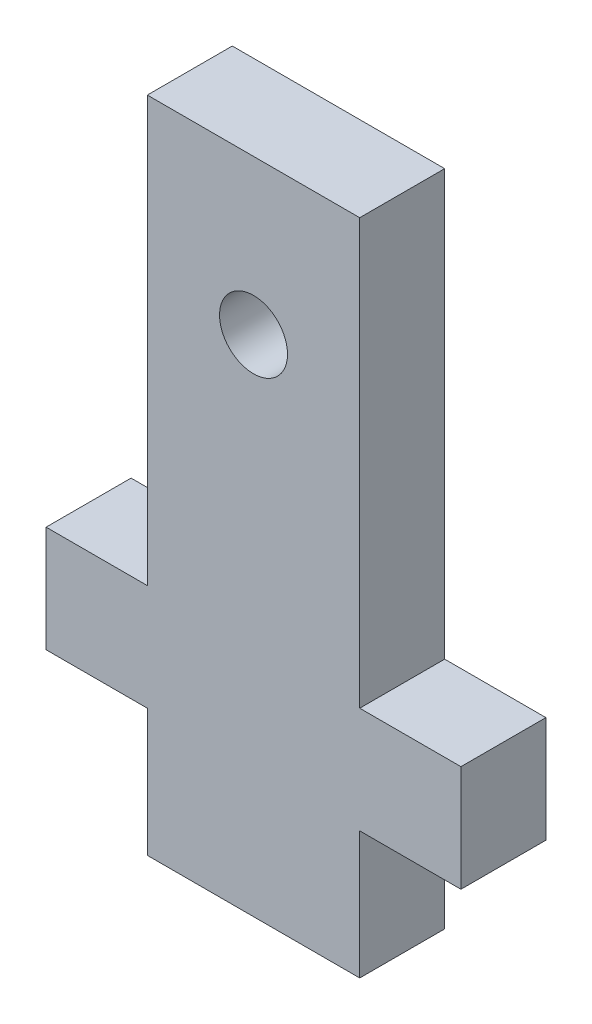
ISO-10303-21;
HEADER;
FILE_DESCRIPTION(('STEP AP214'),'2;1');
FILE_NAME('part.step','',(''),(''),'','','');
FILE_SCHEMA(('AUTOMOTIVE_DESIGN { 1 0 10303 214 1 1 1 1 }'));
ENDSEC;
DATA;
#1=APPLICATION_CONTEXT('core data for automotive mechanical design processes');
#2=APPLICATION_PROTOCOL_DEFINITION('international standard','automotive_design',2000,#1);
#3=PRODUCT_CONTEXT('',#1,'mechanical');
#4=PRODUCT('Part','Part','',(#3));
#5=PRODUCT_RELATED_PRODUCT_CATEGORY('part','',(#4));
#6=PRODUCT_DEFINITION_FORMATION('','',#4);
#7=PRODUCT_DEFINITION_CONTEXT('part definition',#1,'design');
#8=PRODUCT_DEFINITION('design','',#6,#7);
#9=PRODUCT_DEFINITION_SHAPE('','',#8);
#10=(LENGTH_UNIT() NAMED_UNIT(*) SI_UNIT(.MILLI.,.METRE.));
#11=(NAMED_UNIT(*) PLANE_ANGLE_UNIT() SI_UNIT($,.RADIAN.));
#12=(NAMED_UNIT(*) SI_UNIT($,.STERADIAN.) SOLID_ANGLE_UNIT());
#13=UNCERTAINTY_MEASURE_WITH_UNIT(LENGTH_MEASURE(1.E-05),#10,'distance_accuracy_value','');
#14=(GEOMETRIC_REPRESENTATION_CONTEXT(3) GLOBAL_UNCERTAINTY_ASSIGNED_CONTEXT((#13)) GLOBAL_UNIT_ASSIGNED_CONTEXT((#10,
#11,#12)) REPRESENTATION_CONTEXT('',''));
#15=CARTESIAN_POINT('',(0.,0.,0.));
#16=DIRECTION('',(0.,0.,1.));
#17=DIRECTION('',(1.,0.,0.));
#18=AXIS2_PLACEMENT_3D('',#15,#16,#17);
#19=CARTESIAN_POINT('',(0.,7.62,5.08));
#20=DIRECTION('',(1.,0.,0.));
#21=DIRECTION('',(0.,1.,0.));
#22=AXIS2_PLACEMENT_3D('',#19,#20,#21);
#23=PLANE('',#22);
#24=DIRECTION('',(0.,-1.,0.));
#25=VECTOR('',#24,1.);
#26=CARTESIAN_POINT('',(0.,7.62,0.));
#27=LINE('',#26,#25);
#28=CARTESIAN_POINT('',(0.,7.62,0.));
#29=VERTEX_POINT('',#28);
#30=CARTESIAN_POINT('',(0.,0.,0.));
#31=VERTEX_POINT('',#30);
#32=EDGE_CURVE('E154',#29,#31,#27,.T.);
#33=ORIENTED_EDGE('',*,*,#32,.T.);
#34=DIRECTION('',(0.,0.,-1.));
#35=VECTOR('',#34,1.);
#36=CARTESIAN_POINT('',(0.,0.,5.08));
#37=LINE('',#36,#35);
#38=CARTESIAN_POINT('',(0.,0.,5.08));
#39=VERTEX_POINT('',#38);
#40=EDGE_CURVE('E11',#39,#31,#37,.T.);
#41=ORIENTED_EDGE('',*,*,#40,.F.);
#42=DIRECTION('',(0.,-1.,0.));
#43=VECTOR('',#42,1.);
#44=CARTESIAN_POINT('',(0.,7.62,5.08));
#45=LINE('',#44,#43);
#46=CARTESIAN_POINT('',(0.,7.62,5.08));
#47=VERTEX_POINT('',#46);
#48=EDGE_CURVE('E176',#47,#39,#45,.T.);
#49=ORIENTED_EDGE('',*,*,#48,.F.);
#50=DIRECTION('',(0.,0.,-1.));
#51=VECTOR('',#50,1.);
#52=CARTESIAN_POINT('',(0.,7.62,5.08));
#53=LINE('',#52,#51);
#54=EDGE_CURVE('E150',#47,#29,#53,.T.);
#55=ORIENTED_EDGE('',*,*,#54,.T.);
#56=EDGE_LOOP('',(#33,#41,#49,#55));
#57=FACE_BOUND('',#56,.T.);
#58=ADVANCED_FACE('F33',(#57),#23,.F.);
#59=CARTESIAN_POINT('',(0.,0.,5.08));
#60=DIRECTION('',(0.,1.,0.));
#61=DIRECTION('',(0.,0.,1.));
#62=AXIS2_PLACEMENT_3D('',#59,#60,#61);
#63=PLANE('',#62);
#64=DIRECTION('',(1.,0.,0.));
#65=VECTOR('',#64,1.);
#66=CARTESIAN_POINT('',(0.,0.,0.));
#67=LINE('',#66,#65);
#68=CARTESIAN_POINT('',(12.7,0.,0.));
#69=VERTEX_POINT('',#68);
#70=EDGE_CURVE('E157',#31,#69,#67,.T.);
#71=ORIENTED_EDGE('',*,*,#70,.T.);
#72=DIRECTION('',(0.,0.,-1.));
#73=VECTOR('',#72,1.);
#74=CARTESIAN_POINT('',(12.7,0.,5.08));
#75=LINE('',#74,#73);
#76=CARTESIAN_POINT('',(12.7,0.,5.08));
#77=VERTEX_POINT('',#76);
#78=EDGE_CURVE('E42',#77,#69,#75,.T.);
#79=ORIENTED_EDGE('',*,*,#78,.F.);
#80=DIRECTION('',(1.,0.,0.));
#81=VECTOR('',#80,1.);
#82=CARTESIAN_POINT('',(0.,0.,5.08));
#83=LINE('',#82,#81);
#84=EDGE_CURVE('E105',#39,#77,#83,.T.);
#85=ORIENTED_EDGE('',*,*,#84,.F.);
#86=ORIENTED_EDGE('',*,*,#40,.T.);
#87=EDGE_LOOP('',(#71,#79,#85,#86));
#88=FACE_BOUND('',#87,.T.);
#89=ADVANCED_FACE('F256',(#88),#63,.F.);
#90=CARTESIAN_POINT('',(12.7,0.,5.08));
#91=DIRECTION('',(-1.,0.,0.));
#92=DIRECTION('',(0.,0.,1.));
#93=AXIS2_PLACEMENT_3D('',#90,#91,#92);
#94=PLANE('',#93);
#95=DIRECTION('',(0.,1.,0.));
#96=VECTOR('',#95,1.);
#97=CARTESIAN_POINT('',(12.7,0.,0.));
#98=LINE('',#97,#96);
#99=CARTESIAN_POINT('',(12.7,7.62,0.));
#100=VERTEX_POINT('',#99);
#101=EDGE_CURVE('E159',#69,#100,#98,.T.);
#102=ORIENTED_EDGE('',*,*,#101,.T.);
#103=DIRECTION('',(0.,0.,-1.));
#104=VECTOR('',#103,1.);
#105=CARTESIAN_POINT('',(12.7,7.62,5.08));
#106=LINE('',#105,#104);
#107=CARTESIAN_POINT('',(12.7,7.62,5.08));
#108=VERTEX_POINT('',#107);
#109=EDGE_CURVE('E195',#108,#100,#106,.T.);
#110=ORIENTED_EDGE('',*,*,#109,.F.);
#111=DIRECTION('',(0.,1.,0.));
#112=VECTOR('',#111,1.);
#113=CARTESIAN_POINT('',(12.7,0.,5.08));
#114=LINE('',#113,#112);
#115=EDGE_CURVE('E204',#77,#108,#114,.T.);
#116=ORIENTED_EDGE('',*,*,#115,.F.);
#117=ORIENTED_EDGE('',*,*,#78,.T.);
#118=EDGE_LOOP('',(#102,#110,#116,#117));
#119=FACE_BOUND('',#118,.T.);
#120=ADVANCED_FACE('F202',(#119),#94,.F.);
#121=CARTESIAN_POINT('',(12.7,7.62,5.08));
#122=DIRECTION('',(0.,1.,0.));
#123=DIRECTION('',(0.,0.,1.));
#124=AXIS2_PLACEMENT_3D('',#121,#122,#123);
#125=PLANE('',#124);
#126=DIRECTION('',(1.,0.,0.));
#127=VECTOR('',#126,1.);
#128=CARTESIAN_POINT('',(12.7,7.62,0.));
#129=LINE('',#128,#127);
#130=CARTESIAN_POINT('',(18.7514106583072,7.62,0.));
#131=VERTEX_POINT('',#130);
#132=EDGE_CURVE('E161',#100,#131,#129,.T.);
#133=ORIENTED_EDGE('',*,*,#132,.T.);
#134=DIRECTION('',(0.,0.,-1.));
#135=VECTOR('',#134,1.);
#136=CARTESIAN_POINT('',(18.7514106583072,7.62,5.08));
#137=LINE('',#136,#135);
#138=CARTESIAN_POINT('',(18.7514106583072,7.62,5.08));
#139=VERTEX_POINT('',#138);
#140=EDGE_CURVE('E192',#139,#131,#137,.T.);
#141=ORIENTED_EDGE('',*,*,#140,.F.);
#142=DIRECTION('',(1.,0.,0.));
#143=VECTOR('',#142,1.);
#144=CARTESIAN_POINT('',(12.7,7.62,5.08));
#145=LINE('',#144,#143);
#146=EDGE_CURVE('E222',#108,#139,#145,.T.);
#147=ORIENTED_EDGE('',*,*,#146,.F.);
#148=ORIENTED_EDGE('',*,*,#109,.T.);
#149=EDGE_LOOP('',(#133,#141,#147,#148));
#150=FACE_BOUND('',#149,.T.);
#151=ADVANCED_FACE('F213',(#150),#125,.F.);
#152=CARTESIAN_POINT('',(18.7514106583072,7.62,5.08));
#153=DIRECTION('',(-1.,0.,0.));
#154=DIRECTION('',(0.,0.,1.));
#155=AXIS2_PLACEMENT_3D('',#152,#153,#154);
#156=PLANE('',#155);
#157=DIRECTION('',(0.,1.,0.));
#158=VECTOR('',#157,1.);
#159=CARTESIAN_POINT('',(18.7514106583072,7.62,0.));
#160=LINE('',#159,#158);
#161=CARTESIAN_POINT('',(18.7514106583072,13.97,0.));
#162=VERTEX_POINT('',#161);
#163=EDGE_CURVE('E163',#131,#162,#160,.T.);
#164=ORIENTED_EDGE('',*,*,#163,.T.);
#165=DIRECTION('',(0.,0.,-1.));
#166=VECTOR('',#165,1.);
#167=CARTESIAN_POINT('',(18.7514106583072,13.97,5.08));
#168=LINE('',#167,#166);
#169=CARTESIAN_POINT('',(18.7514106583072,13.97,5.08));
#170=VERTEX_POINT('',#169);
#171=EDGE_CURVE('E189',#170,#162,#168,.T.);
#172=ORIENTED_EDGE('',*,*,#171,.F.);
#173=DIRECTION('',(0.,1.,0.));
#174=VECTOR('',#173,1.);
#175=CARTESIAN_POINT('',(18.7514106583072,7.62,5.08));
#176=LINE('',#175,#174);
#177=EDGE_CURVE('E219',#139,#170,#176,.T.);
#178=ORIENTED_EDGE('',*,*,#177,.F.);
#179=ORIENTED_EDGE('',*,*,#140,.T.);
#180=EDGE_LOOP('',(#164,#172,#178,#179));
#181=FACE_BOUND('',#180,.T.);
#182=ADVANCED_FACE('F217',(#181),#156,.F.);
#183=CARTESIAN_POINT('',(18.7514106583072,13.97,5.08));
#184=DIRECTION('',(0.,-1.,0.));
#185=DIRECTION('',(0.,0.,-1.));
#186=AXIS2_PLACEMENT_3D('',#183,#184,#185);
#187=PLANE('',#186);
#188=DIRECTION('',(-1.,0.,0.));
#189=VECTOR('',#188,1.);
#190=CARTESIAN_POINT('',(18.7514106583072,13.97,0.));
#191=LINE('',#190,#189);
#192=CARTESIAN_POINT('',(12.7,13.97,0.));
#193=VERTEX_POINT('',#192);
#194=EDGE_CURVE('E165',#162,#193,#191,.T.);
#195=ORIENTED_EDGE('',*,*,#194,.T.);
#196=DIRECTION('',(0.,0.,-1.));
#197=VECTOR('',#196,1.);
#198=CARTESIAN_POINT('',(12.7,13.97,5.08));
#199=LINE('',#198,#197);
#200=CARTESIAN_POINT('',(12.7,13.97,5.08));
#201=VERTEX_POINT('',#200);
#202=EDGE_CURVE('E186',#201,#193,#199,.T.);
#203=ORIENTED_EDGE('',*,*,#202,.F.);
#204=DIRECTION('',(-1.,0.,0.));
#205=VECTOR('',#204,1.);
#206=CARTESIAN_POINT('',(18.7514106583072,13.97,5.08));
#207=LINE('',#206,#205);
#208=EDGE_CURVE('E221',#170,#201,#207,.T.);
#209=ORIENTED_EDGE('',*,*,#208,.F.);
#210=ORIENTED_EDGE('',*,*,#171,.T.);
#211=EDGE_LOOP('',(#195,#203,#209,#210));
#212=FACE_BOUND('',#211,.T.);
#213=ADVANCED_FACE('F269',(#212),#187,.F.);
#214=CARTESIAN_POINT('',(12.7,13.97,5.08));
#215=DIRECTION('',(-1.,0.,0.));
#216=DIRECTION('',(0.,0.,1.));
#217=AXIS2_PLACEMENT_3D('',#214,#215,#216);
#218=PLANE('',#217);
#219=DIRECTION('',(0.,1.,0.));
#220=VECTOR('',#219,1.);
#221=CARTESIAN_POINT('',(12.7,13.97,0.));
#222=LINE('',#221,#220);
#223=CARTESIAN_POINT('',(12.7,39.37,0.));
#224=VERTEX_POINT('',#223);
#225=EDGE_CURVE('E167',#193,#224,#222,.T.);
#226=ORIENTED_EDGE('',*,*,#225,.T.);
#227=DIRECTION('',(0.,0.,-1.));
#228=VECTOR('',#227,1.);
#229=CARTESIAN_POINT('',(12.7,39.37,5.08));
#230=LINE('',#229,#228);
#231=CARTESIAN_POINT('',(12.7,39.37,5.08));
#232=VERTEX_POINT('',#231);
#233=EDGE_CURVE('E183',#232,#224,#230,.T.);
#234=ORIENTED_EDGE('',*,*,#233,.F.);
#235=DIRECTION('',(0.,1.,0.));
#236=VECTOR('',#235,1.);
#237=CARTESIAN_POINT('',(12.7,13.97,5.08));
#238=LINE('',#237,#236);
#239=EDGE_CURVE('E224',#201,#232,#238,.T.);
#240=ORIENTED_EDGE('',*,*,#239,.F.);
#241=ORIENTED_EDGE('',*,*,#202,.T.);
#242=EDGE_LOOP('',(#226,#234,#240,#241));
#243=FACE_BOUND('',#242,.T.);
#244=ADVANCED_FACE('F272',(#243),#218,.F.);
#245=CARTESIAN_POINT('',(12.7,39.37,5.08));
#246=DIRECTION('',(0.,-1.,0.));
#247=DIRECTION('',(1.,0.,0.));
#248=AXIS2_PLACEMENT_3D('',#245,#246,#247);
#249=PLANE('',#248);
#250=DIRECTION('',(-1.,0.,0.));
#251=VECTOR('',#250,1.);
#252=CARTESIAN_POINT('',(12.7,39.37,0.));
#253=LINE('',#252,#251);
#254=CARTESIAN_POINT('',(0.,39.37,0.));
#255=VERTEX_POINT('',#254);
#256=EDGE_CURVE('E169',#224,#255,#253,.T.);
#257=ORIENTED_EDGE('',*,*,#256,.T.);
#258=DIRECTION('',(0.,0.,-1.));
#259=VECTOR('',#258,1.);
#260=CARTESIAN_POINT('',(0.,39.37,5.08));
#261=LINE('',#260,#259);
#262=CARTESIAN_POINT('',(0.,39.37,5.08));
#263=VERTEX_POINT('',#262);
#264=EDGE_CURVE('E180',#263,#255,#261,.T.);
#265=ORIENTED_EDGE('',*,*,#264,.F.);
#266=DIRECTION('',(-1.,0.,0.));
#267=VECTOR('',#266,1.);
#268=CARTESIAN_POINT('',(12.7,39.37,5.08));
#269=LINE('',#268,#267);
#270=EDGE_CURVE('E230',#232,#263,#269,.T.);
#271=ORIENTED_EDGE('',*,*,#270,.F.);
#272=ORIENTED_EDGE('',*,*,#233,.T.);
#273=EDGE_LOOP('',(#257,#265,#271,#272));
#274=FACE_BOUND('',#273,.T.);
#275=ADVANCED_FACE('F236',(#274),#249,.F.);
#276=CARTESIAN_POINT('',(0.,39.37,5.08));
#277=DIRECTION('',(1.,0.,0.));
#278=DIRECTION('',(0.,1.,0.));
#279=AXIS2_PLACEMENT_3D('',#276,#277,#278);
#280=PLANE('',#279);
#281=DIRECTION('',(0.,-1.,0.));
#282=VECTOR('',#281,1.);
#283=CARTESIAN_POINT('',(0.,39.37,0.));
#284=LINE('',#283,#282);
#285=CARTESIAN_POINT('',(0.,13.97,0.));
#286=VERTEX_POINT('',#285);
#287=EDGE_CURVE('E171',#255,#286,#284,.T.);
#288=ORIENTED_EDGE('',*,*,#287,.T.);
#289=DIRECTION('',(0.,0.,-1.));
#290=VECTOR('',#289,1.);
#291=CARTESIAN_POINT('',(0.,13.97,5.08));
#292=LINE('',#291,#290);
#293=CARTESIAN_POINT('',(0.,13.97,5.08));
#294=VERTEX_POINT('',#293);
#295=EDGE_CURVE('E145',#294,#286,#292,.T.);
#296=ORIENTED_EDGE('',*,*,#295,.F.);
#297=DIRECTION('',(0.,-1.,0.));
#298=VECTOR('',#297,1.);
#299=CARTESIAN_POINT('',(0.,39.37,5.08));
#300=LINE('',#299,#298);
#301=EDGE_CURVE('E136',#263,#294,#300,.T.);
#302=ORIENTED_EDGE('',*,*,#301,.F.);
#303=ORIENTED_EDGE('',*,*,#264,.T.);
#304=EDGE_LOOP('',(#288,#296,#302,#303));
#305=FACE_BOUND('',#304,.T.);
#306=ADVANCED_FACE('F240',(#305),#280,.F.);
#307=CARTESIAN_POINT('',(0.,13.97,5.08));
#308=DIRECTION('',(0.,-1.,0.));
#309=DIRECTION('',(0.,0.,-1.));
#310=AXIS2_PLACEMENT_3D('',#307,#308,#309);
#311=PLANE('',#310);
#312=DIRECTION('',(-1.,0.,0.));
#313=VECTOR('',#312,1.);
#314=CARTESIAN_POINT('',(0.,13.97,0.));
#315=LINE('',#314,#313);
#316=CARTESIAN_POINT('',(-6.05141065830722,13.97,0.));
#317=VERTEX_POINT('',#316);
#318=EDGE_CURVE('E144',#286,#317,#315,.T.);
#319=ORIENTED_EDGE('',*,*,#318,.T.);
#320=DIRECTION('',(0.,0.,-1.));
#321=VECTOR('',#320,1.);
#322=CARTESIAN_POINT('',(-6.05141065830722,13.97,5.08));
#323=LINE('',#322,#321);
#324=CARTESIAN_POINT('',(-6.05141065830722,13.97,5.08));
#325=VERTEX_POINT('',#324);
#326=EDGE_CURVE('E141',#325,#317,#323,.T.);
#327=ORIENTED_EDGE('',*,*,#326,.F.);
#328=DIRECTION('',(-1.,0.,0.));
#329=VECTOR('',#328,1.);
#330=CARTESIAN_POINT('',(0.,13.97,5.08));
#331=LINE('',#330,#329);
#332=EDGE_CURVE('E130',#294,#325,#331,.T.);
#333=ORIENTED_EDGE('',*,*,#332,.F.);
#334=ORIENTED_EDGE('',*,*,#295,.T.);
#335=EDGE_LOOP('',(#319,#327,#333,#334));
#336=FACE_BOUND('',#335,.T.);
#337=ADVANCED_FACE('F142',(#336),#311,.F.);
#338=CARTESIAN_POINT('',(-6.05141065830722,13.97,5.08));
#339=DIRECTION('',(1.,0.,0.));
#340=DIRECTION('',(0.,1.,0.));
#341=AXIS2_PLACEMENT_3D('',#338,#339,#340);
#342=PLANE('',#341);
#343=DIRECTION('',(0.,-1.,0.));
#344=VECTOR('',#343,1.);
#345=CARTESIAN_POINT('',(-6.05141065830722,13.97,0.));
#346=LINE('',#345,#344);
#347=CARTESIAN_POINT('',(-6.05141065830722,7.62,0.));
#348=VERTEX_POINT('',#347);
#349=EDGE_CURVE('E91',#317,#348,#346,.T.);
#350=ORIENTED_EDGE('',*,*,#349,.T.);
#351=DIRECTION('',(0.,0.,-1.));
#352=VECTOR('',#351,1.);
#353=CARTESIAN_POINT('',(-6.05141065830722,7.62,5.08));
#354=LINE('',#353,#352);
#355=CARTESIAN_POINT('',(-6.05141065830722,7.62,5.08));
#356=VERTEX_POINT('',#355);
#357=EDGE_CURVE('E146',#356,#348,#354,.T.);
#358=ORIENTED_EDGE('',*,*,#357,.F.);
#359=DIRECTION('',(0.,-1.,0.));
#360=VECTOR('',#359,1.);
#361=CARTESIAN_POINT('',(-6.05141065830722,13.97,5.08));
#362=LINE('',#361,#360);
#363=EDGE_CURVE('E134',#325,#356,#362,.T.);
#364=ORIENTED_EDGE('',*,*,#363,.F.);
#365=ORIENTED_EDGE('',*,*,#326,.T.);
#366=EDGE_LOOP('',(#350,#358,#364,#365));
#367=FACE_BOUND('',#366,.T.);
#368=ADVANCED_FACE('F148',(#367),#342,.F.);
#369=CARTESIAN_POINT('',(-6.05141065830722,7.62,5.08));
#370=DIRECTION('',(0.,1.,0.));
#371=DIRECTION('',(0.,0.,1.));
#372=AXIS2_PLACEMENT_3D('',#369,#370,#371);
#373=PLANE('',#372);
#374=DIRECTION('',(1.,0.,0.));
#375=VECTOR('',#374,1.);
#376=CARTESIAN_POINT('',(-6.05141065830722,7.62,0.));
#377=LINE('',#376,#375);
#378=EDGE_CURVE('E97',#348,#29,#377,.T.);
#379=ORIENTED_EDGE('',*,*,#378,.T.);
#380=ORIENTED_EDGE('',*,*,#54,.F.);
#381=DIRECTION('',(1.,0.,0.));
#382=VECTOR('',#381,1.);
#383=CARTESIAN_POINT('',(-6.05141065830722,7.62,5.08));
#384=LINE('',#383,#382);
#385=EDGE_CURVE('E50',#356,#47,#384,.T.);
#386=ORIENTED_EDGE('',*,*,#385,.F.);
#387=ORIENTED_EDGE('',*,*,#357,.T.);
#388=EDGE_LOOP('',(#379,#380,#386,#387));
#389=FACE_BOUND('',#388,.T.);
#390=ADVANCED_FACE('F244',(#389),#373,.F.);
#391=CARTESIAN_POINT('',(0.,0.,5.08));
#392=DIRECTION('',(0.,0.,1.));
#393=DIRECTION('',(1.,0.,0.));
#394=AXIS2_PLACEMENT_3D('',#391,#392,#393);
#395=PLANE('',#394);
#396=CARTESIAN_POINT('',(6.35,30.1408654251247,5.08));
#397=DIRECTION('',(0.,0.,1.));
#398=DIRECTION('',(1.,0.,0.));
#399=AXIS2_PLACEMENT_3D('',#396,#397,#398);
#400=CIRCLE('',#399,2.032);
#401=CARTESIAN_POINT('',(8.382,30.1408654251247,5.08));
#402=VERTEX_POINT('',#401);
#403=EDGE_CURVE('E325',#402,#402,#400,.T.);
#404=ORIENTED_EDGE('',*,*,#403,.F.);
#405=EDGE_LOOP('',(#404));
#406=FACE_BOUND('',#405,.T.);
#407=ORIENTED_EDGE('',*,*,#48,.T.);
#408=ORIENTED_EDGE('',*,*,#84,.T.);
#409=ORIENTED_EDGE('',*,*,#115,.T.);
#410=ORIENTED_EDGE('',*,*,#146,.T.);
#411=ORIENTED_EDGE('',*,*,#177,.T.);
#412=ORIENTED_EDGE('',*,*,#208,.T.);
#413=ORIENTED_EDGE('',*,*,#239,.T.);
#414=ORIENTED_EDGE('',*,*,#270,.T.);
#415=ORIENTED_EDGE('',*,*,#301,.T.);
#416=ORIENTED_EDGE('',*,*,#332,.T.);
#417=ORIENTED_EDGE('',*,*,#363,.T.);
#418=ORIENTED_EDGE('',*,*,#385,.T.);
#419=EDGE_LOOP('',(#407,#408,#409,#410,#411,#412,#413,#414,#415,#416,#417,#418));
#420=FACE_BOUND('',#419,.T.);
#421=ADVANCED_FACE('F132',(#406,#420),#395,.T.);
#422=CARTESIAN_POINT('',(0.,0.,0.));
#423=DIRECTION('',(0.,0.,1.));
#424=DIRECTION('',(1.,0.,0.));
#425=AXIS2_PLACEMENT_3D('',#422,#423,#424);
#426=PLANE('',#425);
#427=CARTESIAN_POINT('',(6.35,30.1408654251247,0.));
#428=DIRECTION('',(0.,0.,1.));
#429=DIRECTION('',(1.,0.,0.));
#430=AXIS2_PLACEMENT_3D('',#427,#428,#429);
#431=CIRCLE('',#430,2.032);
#432=CARTESIAN_POINT('',(8.382,30.1408654251247,0.));
#433=VERTEX_POINT('',#432);
#434=EDGE_CURVE('E36',#433,#433,#431,.T.);
#435=ORIENTED_EDGE('',*,*,#434,.T.);
#436=EDGE_LOOP('',(#435));
#437=FACE_BOUND('',#436,.T.);
#438=ORIENTED_EDGE('',*,*,#32,.F.);
#439=ORIENTED_EDGE('',*,*,#378,.F.);
#440=ORIENTED_EDGE('',*,*,#349,.F.);
#441=ORIENTED_EDGE('',*,*,#318,.F.);
#442=ORIENTED_EDGE('',*,*,#287,.F.);
#443=ORIENTED_EDGE('',*,*,#256,.F.);
#444=ORIENTED_EDGE('',*,*,#225,.F.);
#445=ORIENTED_EDGE('',*,*,#194,.F.);
#446=ORIENTED_EDGE('',*,*,#163,.F.);
#447=ORIENTED_EDGE('',*,*,#132,.F.);
#448=ORIENTED_EDGE('',*,*,#101,.F.);
#449=ORIENTED_EDGE('',*,*,#70,.F.);
#450=EDGE_LOOP('',(#438,#439,#440,#441,#442,#443,#444,#445,#446,#447,#448,#449));
#451=FACE_BOUND('',#450,.T.);
#452=ADVANCED_FACE('F208',(#437,#451),#426,.F.);
#453=CARTESIAN_POINT('',(6.35,30.1408654251247,-2.54));
#454=DIRECTION('',(0.,0.,1.));
#455=DIRECTION('',(1.,0.,0.));
#456=AXIS2_PLACEMENT_3D('',#453,#454,#455);
#457=CYLINDRICAL_SURFACE('',#456,2.032);
#458=CARTESIAN_POINT('',(8.382,30.1408654251247,5.08));
#459=CARTESIAN_POINT('',(8.382,30.1408654251247,5.02708333333333));
#460=CARTESIAN_POINT('',(8.382,30.1408654251247,4.97416666666667));
#461=CARTESIAN_POINT('',(8.382,30.1408654251247,4.86833333333333));
#462=CARTESIAN_POINT('',(8.382,30.1408654251247,4.81541666666667));
#463=CARTESIAN_POINT('',(8.382,30.1408654251247,4.70958333333333));
#464=CARTESIAN_POINT('',(8.382,30.1408654251247,4.65666666666667));
#465=CARTESIAN_POINT('',(8.382,30.1408654251247,4.55083333333333));
#466=CARTESIAN_POINT('',(8.382,30.1408654251247,4.49791666666667));
#467=CARTESIAN_POINT('',(8.382,30.1408654251247,4.39208333333333));
#468=CARTESIAN_POINT('',(8.382,30.1408654251247,4.33916666666667));
#469=CARTESIAN_POINT('',(8.382,30.1408654251247,4.23333333333333));
#470=CARTESIAN_POINT('',(8.382,30.1408654251247,4.18041666666667));
#471=CARTESIAN_POINT('',(8.382,30.1408654251247,4.07458333333333));
#472=CARTESIAN_POINT('',(8.382,30.1408654251247,4.02166666666667));
#473=CARTESIAN_POINT('',(8.382,30.1408654251247,3.91583333333333));
#474=CARTESIAN_POINT('',(8.382,30.1408654251247,3.86291666666667));
#475=CARTESIAN_POINT('',(8.382,30.1408654251247,3.75708333333333));
#476=CARTESIAN_POINT('',(8.382,30.1408654251247,3.70416666666667));
#477=CARTESIAN_POINT('',(8.382,30.1408654251247,3.59833333333333));
#478=CARTESIAN_POINT('',(8.382,30.1408654251247,3.54541666666667));
#479=CARTESIAN_POINT('',(8.382,30.1408654251247,3.43958333333333));
#480=CARTESIAN_POINT('',(8.382,30.1408654251247,3.38666666666667));
#481=CARTESIAN_POINT('',(8.382,30.1408654251247,3.28083333333333));
#482=CARTESIAN_POINT('',(8.382,30.1408654251247,3.22791666666667));
#483=CARTESIAN_POINT('',(8.382,30.1408654251247,3.12208333333333));
#484=CARTESIAN_POINT('',(8.382,30.1408654251247,3.06916666666667));
#485=CARTESIAN_POINT('',(8.382,30.1408654251247,2.96333333333333));
#486=CARTESIAN_POINT('',(8.382,30.1408654251247,2.91041666666667));
#487=CARTESIAN_POINT('',(8.382,30.1408654251247,2.80458333333333));
#488=CARTESIAN_POINT('',(8.382,30.1408654251247,2.75166666666667));
#489=CARTESIAN_POINT('',(8.382,30.1408654251247,2.64583333333333));
#490=CARTESIAN_POINT('',(8.382,30.1408654251247,2.59291666666667));
#491=CARTESIAN_POINT('',(8.382,30.1408654251247,2.48708333333333));
#492=CARTESIAN_POINT('',(8.382,30.1408654251247,2.43416666666667));
#493=CARTESIAN_POINT('',(8.382,30.1408654251247,2.32833333333333));
#494=CARTESIAN_POINT('',(8.382,30.1408654251247,2.27541666666667));
#495=CARTESIAN_POINT('',(8.382,30.1408654251247,2.16958333333333));
#496=CARTESIAN_POINT('',(8.382,30.1408654251247,2.11666666666667));
#497=CARTESIAN_POINT('',(8.382,30.1408654251247,2.01083333333333));
#498=CARTESIAN_POINT('',(8.382,30.1408654251247,1.95791666666667));
#499=CARTESIAN_POINT('',(8.382,30.1408654251247,1.85208333333333));
#500=CARTESIAN_POINT('',(8.382,30.1408654251247,1.79916666666667));
#501=CARTESIAN_POINT('',(8.382,30.1408654251247,1.69333333333333));
#502=CARTESIAN_POINT('',(8.382,30.1408654251247,1.64041666666667));
#503=CARTESIAN_POINT('',(8.382,30.1408654251247,1.53458333333333));
#504=CARTESIAN_POINT('',(8.382,30.1408654251247,1.48166666666667));
#505=CARTESIAN_POINT('',(8.382,30.1408654251247,1.37583333333333));
#506=CARTESIAN_POINT('',(8.382,30.1408654251247,1.32291666666667));
#507=CARTESIAN_POINT('',(8.382,30.1408654251247,1.21708333333333));
#508=CARTESIAN_POINT('',(8.382,30.1408654251247,1.16416666666667));
#509=CARTESIAN_POINT('',(8.382,30.1408654251247,1.05833333333333));
#510=CARTESIAN_POINT('',(8.382,30.1408654251247,1.00541666666667));
#511=CARTESIAN_POINT('',(8.382,30.1408654251247,0.899583333333333));
#512=CARTESIAN_POINT('',(8.382,30.1408654251247,0.846666666666666));
#513=CARTESIAN_POINT('',(8.382,30.1408654251247,0.740833333333333));
#514=CARTESIAN_POINT('',(8.382,30.1408654251247,0.687916666666666));
#515=CARTESIAN_POINT('',(8.382,30.1408654251247,0.582083333333333));
#516=CARTESIAN_POINT('',(8.382,30.1408654251247,0.529166666666666));
#517=CARTESIAN_POINT('',(8.382,30.1408654251247,0.423333333333333));
#518=CARTESIAN_POINT('',(8.382,30.1408654251247,0.370416666666666));
#519=CARTESIAN_POINT('',(8.382,30.1408654251247,0.264583333333333));
#520=CARTESIAN_POINT('',(8.382,30.1408654251247,0.211666666666666));
#521=CARTESIAN_POINT('',(8.382,30.1408654251247,0.105833333333333));
#522=CARTESIAN_POINT('',(8.382,30.1408654251247,0.0529166666666662));
#523=CARTESIAN_POINT('',(8.382,30.1408654251247,0.));
#524=B_SPLINE_CURVE_WITH_KNOTS('',3,(#458,#459,#460,#461,#462,#463,#464,#465,#466,#467,#468,
#469,#470,#471,#472,#473,#474,#475,#476,#477,#478,#479,#480,#481,#482,#483,#484,#485,#486,#487,
#488,#489,#490,#491,#492,#493,#494,#495,#496,#497,#498,#499,#500,#501,#502,#503,#504,#505,#506,
#507,#508,#509,#510,#511,#512,#513,#514,#515,#516,#517,#518,#519,#520,#521,#522,#523),
.UNSPECIFIED.,.F.,.F.,(4,2,2,2,2,2,2,2,2,2,2,2,2,2,2,2,2,2,2,2,2,2,2,2,2,2,2,2,2,2,2,2,4),(0.,
0.15875,0.3175,0.47625,0.635,0.79375,0.9525,1.11125,1.27,1.42875,1.5875,1.74625,1.905,2.06375,
2.2225,2.38125,2.54,2.69875,2.8575,3.01625,3.175,3.33375,3.4925,3.65125,3.81,3.96875,4.1275,
4.28625,4.445,4.60375,4.7625,4.92125,5.08),.UNSPECIFIED.);
#525=EDGE_CURVE('BSEAM309',#402,#433,#524,.T.);
#526=ORIENTED_EDGE('',*,*,#403,.T.);
#527=ORIENTED_EDGE('',*,*,#434,.F.);
#528=ORIENTED_EDGE('',*,*,#525,.T.);
#529=ORIENTED_EDGE('',*,*,#525,.F.);
#530=EDGE_LOOP('',(#526,#528,#527,#529));
#531=FACE_BOUND('',#530,.T.);
#532=ADVANCED_FACE('F309',(#531),#457,.F.);
#533=CLOSED_SHELL('',(#58,#89,#120,#151,#182,#213,#244,#275,#306,#337,#368,#390,#421,#452,#532));
#534=MANIFOLD_SOLID_BREP('B2',#533);
#535=ADVANCED_BREP_SHAPE_REPRESENTATION('',(#18,#534),#14);
#536=SHAPE_DEFINITION_REPRESENTATION(#9,#535);
ENDSEC;
END-ISO-10303-21;
